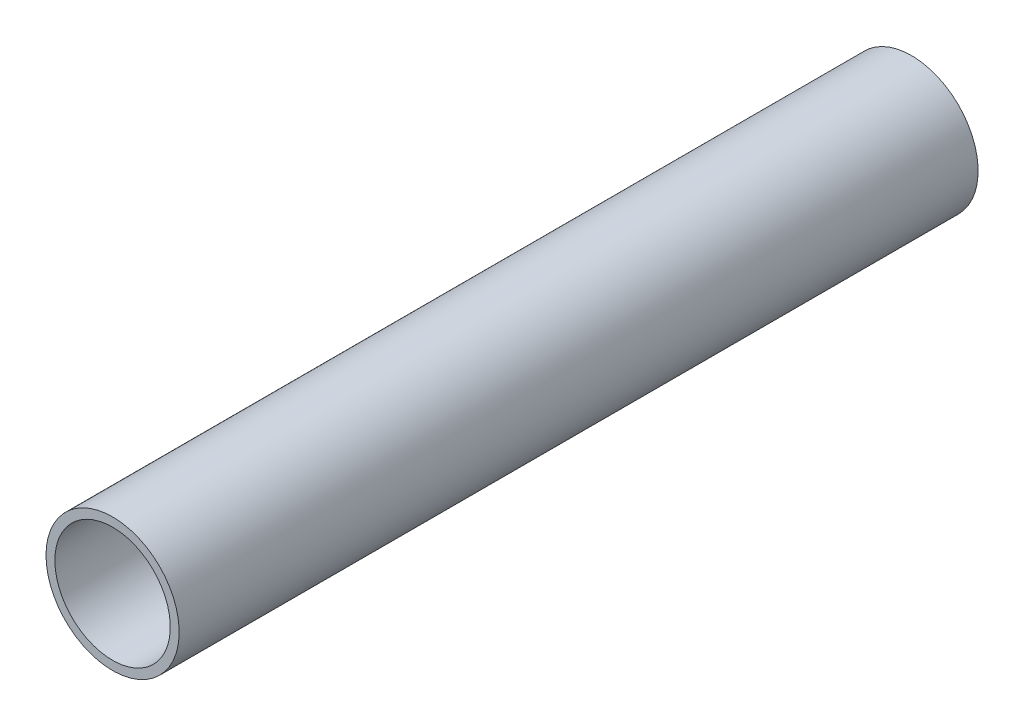
ISO-10303-21;
HEADER;
FILE_DESCRIPTION(('STEP AP214'),'2;1');
FILE_NAME('part.step','',(''),(''),'','','');
FILE_SCHEMA(('AUTOMOTIVE_DESIGN { 1 0 10303 214 1 1 1 1 }'));
ENDSEC;
DATA;
#1=APPLICATION_CONTEXT('core data for automotive mechanical design processes');
#2=APPLICATION_PROTOCOL_DEFINITION('international standard','automotive_design',2000,#1);
#3=PRODUCT_CONTEXT('',#1,'mechanical');
#4=PRODUCT('Part','Part','',(#3));
#5=PRODUCT_RELATED_PRODUCT_CATEGORY('part','',(#4));
#6=PRODUCT_DEFINITION_FORMATION('','',#4);
#7=PRODUCT_DEFINITION_CONTEXT('part definition',#1,'design');
#8=PRODUCT_DEFINITION('design','',#6,#7);
#9=PRODUCT_DEFINITION_SHAPE('','',#8);
#10=(LENGTH_UNIT() NAMED_UNIT(*) SI_UNIT(.MILLI.,.METRE.));
#11=(NAMED_UNIT(*) PLANE_ANGLE_UNIT() SI_UNIT($,.RADIAN.));
#12=(NAMED_UNIT(*) SI_UNIT($,.STERADIAN.) SOLID_ANGLE_UNIT());
#13=UNCERTAINTY_MEASURE_WITH_UNIT(LENGTH_MEASURE(1.E-05),#10,'distance_accuracy_value','');
#14=(GEOMETRIC_REPRESENTATION_CONTEXT(3) GLOBAL_UNCERTAINTY_ASSIGNED_CONTEXT((#13)) GLOBAL_UNIT_ASSIGNED_CONTEXT((#10,
#11,#12)) REPRESENTATION_CONTEXT('',''));
#15=CARTESIAN_POINT('',(0.,0.,0.));
#16=DIRECTION('',(0.,0.,1.));
#17=DIRECTION('',(1.,0.,0.));
#18=AXIS2_PLACEMENT_3D('',#15,#16,#17);
#19=CARTESIAN_POINT('',(0.,0.,90.));
#20=DIRECTION('',(0.,0.,1.));
#21=DIRECTION('',(1.,0.,0.));
#22=AXIS2_PLACEMENT_3D('',#19,#20,#21);
#23=PLANE('',#22);
#24=CARTESIAN_POINT('',(0.,0.,90.));
#25=DIRECTION('',(0.,0.,1.));
#26=DIRECTION('',(1.,0.,0.));
#27=AXIS2_PLACEMENT_3D('',#24,#25,#26);
#28=CIRCLE('',#27,7.5);
#29=CARTESIAN_POINT('',(-7.5,0.,90.));
#30=VERTEX_POINT('',#29);
#31=EDGE_CURVE('E10',#30,#30,#28,.T.);
#32=ORIENTED_EDGE('',*,*,#31,.T.);
#33=EDGE_LOOP('',(#32));
#34=FACE_BOUND('',#33,.T.);
#35=CARTESIAN_POINT('',(0.,0.,90.));
#36=DIRECTION('',(0.,0.,1.));
#37=DIRECTION('',(1.,0.,0.));
#38=AXIS2_PLACEMENT_3D('',#35,#36,#37);
#39=CIRCLE('',#38,6.5);
#40=CARTESIAN_POINT('',(-6.5,0.,90.));
#41=VERTEX_POINT('',#40);
#42=EDGE_CURVE('E41',#41,#41,#39,.T.);
#43=ORIENTED_EDGE('',*,*,#42,.F.);
#44=EDGE_LOOP('',(#43));
#45=FACE_BOUND('',#44,.T.);
#46=ADVANCED_FACE('F30',(#34,#45),#23,.T.);
#47=CARTESIAN_POINT('',(0.,0.,0.));
#48=DIRECTION('',(0.,0.,1.));
#49=DIRECTION('',(1.,0.,0.));
#50=AXIS2_PLACEMENT_3D('',#47,#48,#49);
#51=PLANE('',#50);
#52=CARTESIAN_POINT('',(0.,0.,0.));
#53=DIRECTION('',(0.,0.,1.));
#54=DIRECTION('',(1.,0.,0.));
#55=AXIS2_PLACEMENT_3D('',#52,#53,#54);
#56=CIRCLE('',#55,7.5);
#57=CARTESIAN_POINT('',(-7.5,0.,0.));
#58=VERTEX_POINT('',#57);
#59=EDGE_CURVE('E34',#58,#58,#56,.T.);
#60=ORIENTED_EDGE('',*,*,#59,.F.);
#61=EDGE_LOOP('',(#60));
#62=FACE_BOUND('',#61,.T.);
#63=CARTESIAN_POINT('',(0.,0.,0.));
#64=DIRECTION('',(0.,0.,1.));
#65=DIRECTION('',(1.,0.,0.));
#66=AXIS2_PLACEMENT_3D('',#63,#64,#65);
#67=CIRCLE('',#66,6.5);
#68=CARTESIAN_POINT('',(-6.5,0.,0.));
#69=VERTEX_POINT('',#68);
#70=EDGE_CURVE('E43',#69,#69,#67,.T.);
#71=ORIENTED_EDGE('',*,*,#70,.T.);
#72=EDGE_LOOP('',(#71));
#73=FACE_BOUND('',#72,.T.);
#74=ADVANCED_FACE('F53',(#62,#73),#51,.F.);
#75=CARTESIAN_POINT('',(0.,0.,90.));
#76=DIRECTION('',(0.,0.,-1.));
#77=DIRECTION('',(-1.,0.,0.));
#78=AXIS2_PLACEMENT_3D('',#75,#76,#77);
#79=CYLINDRICAL_SURFACE('',#78,7.5);
#80=CARTESIAN_POINT('',(-7.5,0.,90.));
#81=CARTESIAN_POINT('',(-7.5,0.,89.0625));
#82=CARTESIAN_POINT('',(-7.5,0.,88.125));
#83=CARTESIAN_POINT('',(-7.5,0.,86.25));
#84=CARTESIAN_POINT('',(-7.5,0.,85.3125));
#85=CARTESIAN_POINT('',(-7.5,0.,83.4375));
#86=CARTESIAN_POINT('',(-7.5,0.,82.5));
#87=CARTESIAN_POINT('',(-7.5,0.,80.625));
#88=CARTESIAN_POINT('',(-7.5,0.,79.6875));
#89=CARTESIAN_POINT('',(-7.5,0.,77.8125));
#90=CARTESIAN_POINT('',(-7.5,0.,76.875));
#91=CARTESIAN_POINT('',(-7.5,0.,75.));
#92=CARTESIAN_POINT('',(-7.5,0.,74.0625));
#93=CARTESIAN_POINT('',(-7.5,0.,72.1875));
#94=CARTESIAN_POINT('',(-7.5,0.,71.25));
#95=CARTESIAN_POINT('',(-7.5,0.,69.375));
#96=CARTESIAN_POINT('',(-7.5,0.,68.4375));
#97=CARTESIAN_POINT('',(-7.5,0.,66.5625));
#98=CARTESIAN_POINT('',(-7.5,0.,65.625));
#99=CARTESIAN_POINT('',(-7.5,0.,63.75));
#100=CARTESIAN_POINT('',(-7.5,0.,62.8125));
#101=CARTESIAN_POINT('',(-7.5,0.,60.9375));
#102=CARTESIAN_POINT('',(-7.5,0.,60.));
#103=CARTESIAN_POINT('',(-7.5,0.,58.125));
#104=CARTESIAN_POINT('',(-7.5,0.,57.1875));
#105=CARTESIAN_POINT('',(-7.5,0.,55.3125));
#106=CARTESIAN_POINT('',(-7.5,0.,54.375));
#107=CARTESIAN_POINT('',(-7.5,0.,52.5));
#108=CARTESIAN_POINT('',(-7.5,0.,51.5625));
#109=CARTESIAN_POINT('',(-7.5,0.,49.6875));
#110=CARTESIAN_POINT('',(-7.5,0.,48.75));
#111=CARTESIAN_POINT('',(-7.5,0.,46.875));
#112=CARTESIAN_POINT('',(-7.5,0.,45.9375));
#113=CARTESIAN_POINT('',(-7.5,0.,44.0625));
#114=CARTESIAN_POINT('',(-7.5,0.,43.125));
#115=CARTESIAN_POINT('',(-7.5,0.,41.25));
#116=CARTESIAN_POINT('',(-7.5,0.,40.3125));
#117=CARTESIAN_POINT('',(-7.5,0.,38.4375));
#118=CARTESIAN_POINT('',(-7.5,0.,37.5));
#119=CARTESIAN_POINT('',(-7.5,0.,35.625));
#120=CARTESIAN_POINT('',(-7.5,0.,34.6875));
#121=CARTESIAN_POINT('',(-7.5,0.,32.8125));
#122=CARTESIAN_POINT('',(-7.5,0.,31.875));
#123=CARTESIAN_POINT('',(-7.5,0.,30.));
#124=CARTESIAN_POINT('',(-7.5,0.,29.0625));
#125=CARTESIAN_POINT('',(-7.5,0.,27.1875));
#126=CARTESIAN_POINT('',(-7.5,0.,26.25));
#127=CARTESIAN_POINT('',(-7.5,0.,24.375));
#128=CARTESIAN_POINT('',(-7.5,0.,23.4375));
#129=CARTESIAN_POINT('',(-7.5,0.,21.5625));
#130=CARTESIAN_POINT('',(-7.5,0.,20.625));
#131=CARTESIAN_POINT('',(-7.5,0.,18.75));
#132=CARTESIAN_POINT('',(-7.5,0.,17.8125));
#133=CARTESIAN_POINT('',(-7.5,0.,15.9375));
#134=CARTESIAN_POINT('',(-7.5,0.,15.));
#135=CARTESIAN_POINT('',(-7.5,0.,13.125));
#136=CARTESIAN_POINT('',(-7.5,0.,12.1875));
#137=CARTESIAN_POINT('',(-7.5,0.,10.3125));
#138=CARTESIAN_POINT('',(-7.5,0.,9.37499999999999));
#139=CARTESIAN_POINT('',(-7.5,0.,7.49999999999999));
#140=CARTESIAN_POINT('',(-7.5,0.,6.56249999999999));
#141=CARTESIAN_POINT('',(-7.5,0.,4.68749999999999));
#142=CARTESIAN_POINT('',(-7.5,0.,3.74999999999998));
#143=CARTESIAN_POINT('',(-7.5,0.,1.87499999999998));
#144=CARTESIAN_POINT('',(-7.5,0.,0.937499999999986));
#145=CARTESIAN_POINT('',(-7.5,0.,0.));
#146=B_SPLINE_CURVE_WITH_KNOTS('',3,(#80,#81,#82,#83,#84,#85,#86,#87,#88,#89,#90,#91,#92,#93,
#94,#95,#96,#97,#98,#99,#100,#101,#102,#103,#104,#105,#106,#107,#108,#109,#110,#111,#112,#113,
#114,#115,#116,#117,#118,#119,#120,#121,#122,#123,#124,#125,#126,#127,#128,#129,#130,#131,#132,
#133,#134,#135,#136,#137,#138,#139,#140,#141,#142,#143,#144,#145),.UNSPECIFIED.,.F.,.F.,(4,2,2,
2,2,2,2,2,2,2,2,2,2,2,2,2,2,2,2,2,2,2,2,2,2,2,2,2,2,2,2,2,4),(0.,2.8125,5.62499999999999,
8.43749999999999,11.25,14.0625,16.875,19.6875,22.5,25.3125,28.125,30.9375,33.75,36.5625,39.375,
42.1875,45.,47.8125,50.625,53.4375,56.25,59.0625,61.875,64.6875,67.5,70.3125,73.125,75.9375,
78.75,81.5625,84.375,87.1875,90.),.UNSPECIFIED.);
#147=EDGE_CURVE('BSEAM32',#30,#58,#146,.T.);
#148=ORIENTED_EDGE('',*,*,#31,.F.);
#149=ORIENTED_EDGE('',*,*,#59,.T.);
#150=ORIENTED_EDGE('',*,*,#147,.T.);
#151=ORIENTED_EDGE('',*,*,#147,.F.);
#152=EDGE_LOOP('',(#148,#150,#149,#151));
#153=FACE_BOUND('',#152,.T.);
#154=ADVANCED_FACE('F32',(#153),#79,.T.);
#155=CARTESIAN_POINT('',(0.,0.,90.));
#156=DIRECTION('',(0.,0.,-1.));
#157=DIRECTION('',(-1.,0.,0.));
#158=AXIS2_PLACEMENT_3D('',#155,#156,#157);
#159=CYLINDRICAL_SURFACE('',#158,6.5);
#160=CARTESIAN_POINT('',(-6.5,0.,90.));
#161=CARTESIAN_POINT('',(-6.5,0.,89.0625));
#162=CARTESIAN_POINT('',(-6.5,0.,88.125));
#163=CARTESIAN_POINT('',(-6.5,0.,86.25));
#164=CARTESIAN_POINT('',(-6.5,0.,85.3125));
#165=CARTESIAN_POINT('',(-6.5,0.,83.4375));
#166=CARTESIAN_POINT('',(-6.5,0.,82.5));
#167=CARTESIAN_POINT('',(-6.5,0.,80.625));
#168=CARTESIAN_POINT('',(-6.5,0.,79.6875));
#169=CARTESIAN_POINT('',(-6.5,0.,77.8125));
#170=CARTESIAN_POINT('',(-6.5,0.,76.875));
#171=CARTESIAN_POINT('',(-6.5,0.,75.));
#172=CARTESIAN_POINT('',(-6.5,0.,74.0625));
#173=CARTESIAN_POINT('',(-6.5,0.,72.1875));
#174=CARTESIAN_POINT('',(-6.5,0.,71.25));
#175=CARTESIAN_POINT('',(-6.5,0.,69.375));
#176=CARTESIAN_POINT('',(-6.5,0.,68.4375));
#177=CARTESIAN_POINT('',(-6.5,0.,66.5625));
#178=CARTESIAN_POINT('',(-6.5,0.,65.625));
#179=CARTESIAN_POINT('',(-6.5,0.,63.75));
#180=CARTESIAN_POINT('',(-6.5,0.,62.8125));
#181=CARTESIAN_POINT('',(-6.5,0.,60.9375));
#182=CARTESIAN_POINT('',(-6.5,0.,60.));
#183=CARTESIAN_POINT('',(-6.5,0.,58.125));
#184=CARTESIAN_POINT('',(-6.5,0.,57.1875));
#185=CARTESIAN_POINT('',(-6.5,0.,55.3125));
#186=CARTESIAN_POINT('',(-6.5,0.,54.375));
#187=CARTESIAN_POINT('',(-6.5,0.,52.5));
#188=CARTESIAN_POINT('',(-6.5,0.,51.5625));
#189=CARTESIAN_POINT('',(-6.5,0.,49.6875));
#190=CARTESIAN_POINT('',(-6.5,0.,48.75));
#191=CARTESIAN_POINT('',(-6.5,0.,46.875));
#192=CARTESIAN_POINT('',(-6.5,0.,45.9375));
#193=CARTESIAN_POINT('',(-6.5,0.,44.0625));
#194=CARTESIAN_POINT('',(-6.5,0.,43.125));
#195=CARTESIAN_POINT('',(-6.5,0.,41.25));
#196=CARTESIAN_POINT('',(-6.5,0.,40.3125));
#197=CARTESIAN_POINT('',(-6.5,0.,38.4375));
#198=CARTESIAN_POINT('',(-6.5,0.,37.5));
#199=CARTESIAN_POINT('',(-6.5,0.,35.625));
#200=CARTESIAN_POINT('',(-6.5,0.,34.6875));
#201=CARTESIAN_POINT('',(-6.5,0.,32.8125));
#202=CARTESIAN_POINT('',(-6.5,0.,31.875));
#203=CARTESIAN_POINT('',(-6.5,0.,30.));
#204=CARTESIAN_POINT('',(-6.5,0.,29.0625));
#205=CARTESIAN_POINT('',(-6.5,0.,27.1875));
#206=CARTESIAN_POINT('',(-6.5,0.,26.25));
#207=CARTESIAN_POINT('',(-6.5,0.,24.375));
#208=CARTESIAN_POINT('',(-6.5,0.,23.4375));
#209=CARTESIAN_POINT('',(-6.5,0.,21.5625));
#210=CARTESIAN_POINT('',(-6.5,0.,20.625));
#211=CARTESIAN_POINT('',(-6.5,0.,18.75));
#212=CARTESIAN_POINT('',(-6.5,0.,17.8125));
#213=CARTESIAN_POINT('',(-6.5,0.,15.9375));
#214=CARTESIAN_POINT('',(-6.5,0.,15.));
#215=CARTESIAN_POINT('',(-6.5,0.,13.125));
#216=CARTESIAN_POINT('',(-6.5,0.,12.1875));
#217=CARTESIAN_POINT('',(-6.5,0.,10.3125));
#218=CARTESIAN_POINT('',(-6.5,0.,9.37499999999999));
#219=CARTESIAN_POINT('',(-6.5,0.,7.49999999999999));
#220=CARTESIAN_POINT('',(-6.5,0.,6.56249999999999));
#221=CARTESIAN_POINT('',(-6.5,0.,4.68749999999999));
#222=CARTESIAN_POINT('',(-6.5,0.,3.74999999999998));
#223=CARTESIAN_POINT('',(-6.5,0.,1.87499999999998));
#224=CARTESIAN_POINT('',(-6.5,0.,0.937499999999986));
#225=CARTESIAN_POINT('',(-6.5,0.,0.));
#226=B_SPLINE_CURVE_WITH_KNOTS('',3,(#160,#161,#162,#163,#164,#165,#166,#167,#168,#169,#170,
#171,#172,#173,#174,#175,#176,#177,#178,#179,#180,#181,#182,#183,#184,#185,#186,#187,#188,#189,
#190,#191,#192,#193,#194,#195,#196,#197,#198,#199,#200,#201,#202,#203,#204,#205,#206,#207,#208,
#209,#210,#211,#212,#213,#214,#215,#216,#217,#218,#219,#220,#221,#222,#223,#224,#225),
.UNSPECIFIED.,.F.,.F.,(4,2,2,2,2,2,2,2,2,2,2,2,2,2,2,2,2,2,2,2,2,2,2,2,2,2,2,2,2,2,2,2,4),(0.,
2.81250000000001,5.62500000000001,8.43750000000001,11.25,14.0625,16.875,19.6875,22.5,25.3125,
28.125,30.9375,33.75,36.5625,39.375,42.1875,45.,47.8125,50.625,53.4375,56.25,59.0625,61.875,
64.6875,67.5,70.3125,73.125,75.9375,78.75,81.5625,84.375,87.1875,90.),.UNSPECIFIED.);
#227=EDGE_CURVE('BSEAM49',#41,#69,#226,.T.);
#228=ORIENTED_EDGE('',*,*,#42,.T.);
#229=ORIENTED_EDGE('',*,*,#70,.F.);
#230=ORIENTED_EDGE('',*,*,#227,.T.);
#231=ORIENTED_EDGE('',*,*,#227,.F.);
#232=EDGE_LOOP('',(#228,#230,#229,#231));
#233=FACE_BOUND('',#232,.T.);
#234=ADVANCED_FACE('F49',(#233),#159,.F.);
#235=CLOSED_SHELL('',(#46,#74,#154,#234));
#236=MANIFOLD_SOLID_BREP('B2',#235);
#237=ADVANCED_BREP_SHAPE_REPRESENTATION('',(#18,#236),#14);
#238=SHAPE_DEFINITION_REPRESENTATION(#9,#237);
ENDSEC;
END-ISO-10303-21;
